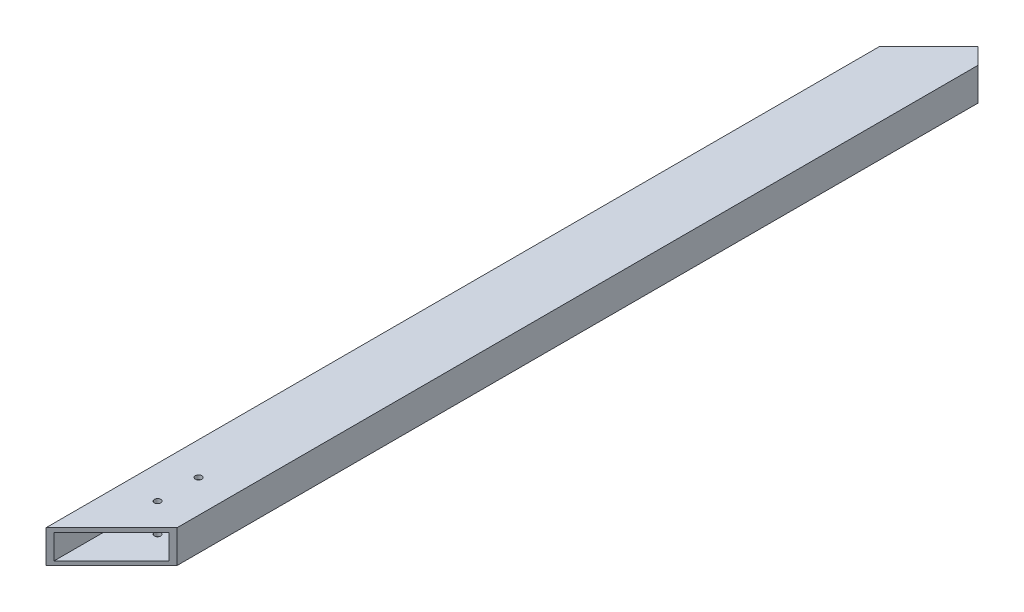
ISO-10303-21;
HEADER;
FILE_DESCRIPTION(('STEP AP214'),'2;1');
FILE_NAME('part.step','',(''),(''),'','','');
FILE_SCHEMA(('AUTOMOTIVE_DESIGN { 1 0 10303 214 1 1 1 1 }'));
ENDSEC;
DATA;
#1=APPLICATION_CONTEXT('core data for automotive mechanical design processes');
#2=APPLICATION_PROTOCOL_DEFINITION('international standard','automotive_design',2000,#1);
#3=PRODUCT_CONTEXT('',#1,'mechanical');
#4=PRODUCT('Part','Part','',(#3));
#5=PRODUCT_RELATED_PRODUCT_CATEGORY('part','',(#4));
#6=PRODUCT_DEFINITION_FORMATION('','',#4);
#7=PRODUCT_DEFINITION_CONTEXT('part definition',#1,'design');
#8=PRODUCT_DEFINITION('design','',#6,#7);
#9=PRODUCT_DEFINITION_SHAPE('','',#8);
#10=(LENGTH_UNIT() NAMED_UNIT(*) SI_UNIT(.MILLI.,.METRE.));
#11=(NAMED_UNIT(*) PLANE_ANGLE_UNIT() SI_UNIT($,.RADIAN.));
#12=(NAMED_UNIT(*) SI_UNIT($,.STERADIAN.) SOLID_ANGLE_UNIT());
#13=UNCERTAINTY_MEASURE_WITH_UNIT(LENGTH_MEASURE(1.E-05),#10,'distance_accuracy_value','');
#14=(GEOMETRIC_REPRESENTATION_CONTEXT(3) GLOBAL_UNCERTAINTY_ASSIGNED_CONTEXT((#13)) GLOBAL_UNIT_ASSIGNED_CONTEXT((#10,
#11,#12)) REPRESENTATION_CONTEXT('',''));
#15=CARTESIAN_POINT('',(0.,0.,0.));
#16=DIRECTION('',(0.,0.,1.));
#17=DIRECTION('',(1.,0.,0.));
#18=AXIS2_PLACEMENT_3D('',#15,#16,#17);
#19=CARTESIAN_POINT('',(-25.4,-12.7,697.2046));
#20=DIRECTION('',(1.,0.,0.));
#21=DIRECTION('',(0.,0.,-1.));
#22=AXIS2_PLACEMENT_3D('',#19,#20,#21);
#23=PLANE('',#22);
#24=DIRECTION('',(0.,0.,-1.));
#25=VECTOR('',#24,1.);
#26=CARTESIAN_POINT('',(-25.4,12.7,697.2046));
#27=LINE('',#26,#25);
#28=CARTESIAN_POINT('',(-25.4,12.7,697.2046));
#29=VERTEX_POINT('',#28);
#30=CARTESIAN_POINT('',(-25.4,12.7,50.8000000000008));
#31=VERTEX_POINT('',#30);
#32=EDGE_CURVE('E136',#29,#31,#27,.T.);
#33=ORIENTED_EDGE('',*,*,#32,.T.);
#34=DIRECTION('',(0.,1.,0.));
#35=VECTOR('',#34,1.);
#36=CARTESIAN_POINT('',(-25.4,-12.7,50.8000000000008));
#37=LINE('',#36,#35);
#38=CARTESIAN_POINT('',(-25.4,-12.7,50.8000000000008));
#39=VERTEX_POINT('',#38);
#40=EDGE_CURVE('E55',#39,#31,#37,.T.);
#41=ORIENTED_EDGE('',*,*,#40,.F.);
#42=DIRECTION('',(0.,0.,-1.));
#43=VECTOR('',#42,1.);
#44=CARTESIAN_POINT('',(-25.4,-12.7,697.2046));
#45=LINE('',#44,#43);
#46=CARTESIAN_POINT('',(-25.4,-12.7,697.2046));
#47=VERTEX_POINT('',#46);
#48=EDGE_CURVE('E131',#47,#39,#45,.T.);
#49=ORIENTED_EDGE('',*,*,#48,.F.);
#50=DIRECTION('',(0.,-1.,0.));
#51=VECTOR('',#50,1.);
#52=CARTESIAN_POINT('',(-25.4,-12.7,697.2046));
#53=LINE('',#52,#51);
#54=EDGE_CURVE('E170',#29,#47,#53,.T.);
#55=ORIENTED_EDGE('',*,*,#54,.F.);
#56=EDGE_LOOP('',(#33,#41,#49,#55));
#57=FACE_BOUND('',#56,.T.);
#58=ADVANCED_FACE('F33',(#57),#23,.F.);
#59=CARTESIAN_POINT('',(25.4,-12.7,697.2046));
#60=DIRECTION('',(0.,1.,0.));
#61=DIRECTION('',(-1.,0.,0.));
#62=AXIS2_PLACEMENT_3D('',#59,#60,#61);
#63=PLANE('',#62);
#64=CARTESIAN_POINT('',(-1.56892727976032E-11,-12.7,604.320502062895));
#65=DIRECTION('',(0.,-1.,0.));
#66=DIRECTION('',(0.,0.,-1.));
#67=AXIS2_PLACEMENT_3D('',#64,#65,#66);
#68=CIRCLE('',#67,2.45744999999999);
#69=CARTESIAN_POINT('',(-1.56892727976032E-11,-12.7,601.863052062895));
#70=VERTEX_POINT('',#69);
#71=EDGE_CURVE('E234',#70,#70,#68,.T.);
#72=ORIENTED_EDGE('',*,*,#71,.F.);
#73=EDGE_LOOP('',(#72));
#74=FACE_BOUND('',#73,.T.);
#75=CARTESIAN_POINT('',(-1.5481105980486E-11,-12.7,636.070502062895));
#76=DIRECTION('',(0.,-1.,0.));
#77=DIRECTION('',(0.,0.,-1.));
#78=AXIS2_PLACEMENT_3D('',#75,#76,#77);
#79=CIRCLE('',#78,2.45744999999999);
#80=CARTESIAN_POINT('',(-1.5481105980486E-11,-12.7,633.613052062895));
#81=VERTEX_POINT('',#80);
#82=EDGE_CURVE('E222',#81,#81,#79,.T.);
#83=ORIENTED_EDGE('',*,*,#82,.F.);
#84=EDGE_LOOP('',(#83));
#85=FACE_BOUND('',#84,.T.);
#86=DIRECTION('',(0.707106781186542,0.,-0.707106781186553));
#87=VECTOR('',#86,1.);
#88=CARTESIAN_POINT('',(25.4,-12.7,0.));
#89=LINE('',#88,#87);
#90=CARTESIAN_POINT('',(12.7508,-12.7,12.6492000000002));
#91=VERTEX_POINT('',#90);
#92=EDGE_CURVE('E126',#39,#91,#89,.T.);
#93=ORIENTED_EDGE('',*,*,#92,.T.);
#94=DIRECTION('',(0.707106781186559,0.,0.707106781186536));
#95=VECTOR('',#94,1.);
#96=CARTESIAN_POINT('',(25.4,-12.7,25.2984));
#97=LINE('',#96,#95);
#98=CARTESIAN_POINT('',(25.4,-12.7,25.2984));
#99=VERTEX_POINT('',#98);
#100=EDGE_CURVE('E47',#91,#99,#97,.T.);
#101=ORIENTED_EDGE('',*,*,#100,.T.);
#102=DIRECTION('',(0.,0.,-1.));
#103=VECTOR('',#102,1.);
#104=CARTESIAN_POINT('',(25.4,-12.7,697.2046));
#105=LINE('',#104,#103);
#106=CARTESIAN_POINT('',(25.4,-12.7,646.4046));
#107=VERTEX_POINT('',#106);
#108=EDGE_CURVE('E124',#107,#99,#105,.T.);
#109=ORIENTED_EDGE('',*,*,#108,.F.);
#110=DIRECTION('',(-0.707106781186546,0.,0.707106781186549));
#111=VECTOR('',#110,1.);
#112=CARTESIAN_POINT('',(-25.4,-12.7,697.2046));
#113=LINE('',#112,#111);
#114=EDGE_CURVE('E191',#107,#47,#113,.T.);
#115=ORIENTED_EDGE('',*,*,#114,.T.);
#116=ORIENTED_EDGE('',*,*,#48,.T.);
#117=EDGE_LOOP('',(#93,#101,#109,#115,#116));
#118=FACE_BOUND('',#117,.T.);
#119=ADVANCED_FACE('F122',(#74,#85,#118),#63,.F.);
#120=CARTESIAN_POINT('',(25.4,-12.7,697.2046));
#121=DIRECTION('',(-1.,0.,0.));
#122=DIRECTION('',(0.,0.,1.));
#123=AXIS2_PLACEMENT_3D('',#120,#121,#122);
#124=PLANE('',#123);
#125=ORIENTED_EDGE('',*,*,#108,.T.);
#126=DIRECTION('',(0.,1.,0.));
#127=VECTOR('',#126,1.);
#128=CARTESIAN_POINT('',(25.4,-12.7,25.2984));
#129=LINE('',#128,#127);
#130=CARTESIAN_POINT('',(25.4,12.7,25.2984));
#131=VERTEX_POINT('',#130);
#132=EDGE_CURVE('E108',#99,#131,#129,.T.);
#133=ORIENTED_EDGE('',*,*,#132,.T.);
#134=DIRECTION('',(0.,0.,-1.));
#135=VECTOR('',#134,1.);
#136=CARTESIAN_POINT('',(25.4,12.7,697.2046));
#137=LINE('',#136,#135);
#138=CARTESIAN_POINT('',(25.4,12.7,646.4046));
#139=VERTEX_POINT('',#138);
#140=EDGE_CURVE('E132',#139,#131,#137,.T.);
#141=ORIENTED_EDGE('',*,*,#140,.F.);
#142=DIRECTION('',(0.,1.,0.));
#143=VECTOR('',#142,1.);
#144=CARTESIAN_POINT('',(25.4,-12.7,646.4046));
#145=LINE('',#144,#143);
#146=EDGE_CURVE('E130',#107,#139,#145,.T.);
#147=ORIENTED_EDGE('',*,*,#146,.F.);
#148=EDGE_LOOP('',(#125,#133,#141,#147));
#149=FACE_BOUND('',#148,.T.);
#150=ADVANCED_FACE('F129',(#149),#124,.F.);
#151=CARTESIAN_POINT('',(25.4,12.7,697.2046));
#152=DIRECTION('',(0.,-1.,0.));
#153=DIRECTION('',(1.,0.,0.));
#154=AXIS2_PLACEMENT_3D('',#151,#152,#153);
#155=PLANE('',#154);
#156=CARTESIAN_POINT('',(-1.56892727976032E-11,12.7,604.320502062895));
#157=DIRECTION('',(0.,-1.,0.));
#158=DIRECTION('',(0.,0.,-1.));
#159=AXIS2_PLACEMENT_3D('',#156,#157,#158);
#160=CIRCLE('',#159,2.45744999999998);
#161=CARTESIAN_POINT('',(-1.56892727976032E-11,12.7,601.863052062895));
#162=VERTEX_POINT('',#161);
#163=EDGE_CURVE('E231',#162,#162,#160,.T.);
#164=ORIENTED_EDGE('',*,*,#163,.T.);
#165=EDGE_LOOP('',(#164));
#166=FACE_BOUND('',#165,.T.);
#167=CARTESIAN_POINT('',(-1.5481105980486E-11,12.7,636.070502062895));
#168=DIRECTION('',(0.,-1.,0.));
#169=DIRECTION('',(0.,0.,-1.));
#170=AXIS2_PLACEMENT_3D('',#167,#168,#169);
#171=CIRCLE('',#170,2.45744999999998);
#172=CARTESIAN_POINT('',(-1.5481105980486E-11,12.7,633.613052062895));
#173=VERTEX_POINT('',#172);
#174=EDGE_CURVE('E219',#173,#173,#171,.T.);
#175=ORIENTED_EDGE('',*,*,#174,.T.);
#176=EDGE_LOOP('',(#175));
#177=FACE_BOUND('',#176,.T.);
#178=ORIENTED_EDGE('',*,*,#140,.T.);
#179=DIRECTION('',(0.707106781186559,0.,0.707106781186536));
#180=VECTOR('',#179,1.);
#181=CARTESIAN_POINT('',(25.4,12.7,25.2984));
#182=LINE('',#181,#180);
#183=CARTESIAN_POINT('',(12.7508,12.7,12.6492000000004));
#184=VERTEX_POINT('',#183);
#185=EDGE_CURVE('E111',#184,#131,#182,.T.);
#186=ORIENTED_EDGE('',*,*,#185,.F.);
#187=DIRECTION('',(0.707106781186542,0.,-0.707106781186553));
#188=VECTOR('',#187,1.);
#189=CARTESIAN_POINT('',(25.4,12.7,0.));
#190=LINE('',#189,#188);
#191=EDGE_CURVE('E180',#31,#184,#190,.T.);
#192=ORIENTED_EDGE('',*,*,#191,.F.);
#193=ORIENTED_EDGE('',*,*,#32,.F.);
#194=DIRECTION('',(-0.707106781186546,0.,0.707106781186549));
#195=VECTOR('',#194,1.);
#196=CARTESIAN_POINT('',(-25.4,12.7,697.2046));
#197=LINE('',#196,#195);
#198=EDGE_CURVE('E179',#139,#29,#197,.T.);
#199=ORIENTED_EDGE('',*,*,#198,.F.);
#200=EDGE_LOOP('',(#178,#186,#192,#193,#199));
#201=FACE_BOUND('',#200,.T.);
#202=ADVANCED_FACE('F178',(#166,#177,#201),#155,.F.);
#203=CARTESIAN_POINT('',(22.225,-9.525,697.2046));
#204=DIRECTION('',(-1.,0.,0.));
#205=DIRECTION('',(0.,0.,1.));
#206=AXIS2_PLACEMENT_3D('',#203,#204,#205);
#207=PLANE('',#206);
#208=DIRECTION('',(0.,1.,0.));
#209=VECTOR('',#208,1.);
#210=CARTESIAN_POINT('',(22.225,-9.5249999999999,22.1234));
#211=LINE('',#210,#209);
#212=CARTESIAN_POINT('',(22.2249999999999,-9.525,22.1233999999999));
#213=VERTEX_POINT('',#212);
#214=CARTESIAN_POINT('',(22.225,9.525,22.1234));
#215=VERTEX_POINT('',#214);
#216=EDGE_CURVE('E184',#213,#215,#211,.T.);
#217=ORIENTED_EDGE('',*,*,#216,.F.);
#218=DIRECTION('',(0.,0.,-1.));
#219=VECTOR('',#218,1.);
#220=CARTESIAN_POINT('',(22.225,-9.525,697.2046));
#221=LINE('',#220,#219);
#222=CARTESIAN_POINT('',(22.225,-9.525,649.5796));
#223=VERTEX_POINT('',#222);
#224=EDGE_CURVE('E160',#223,#213,#221,.T.);
#225=ORIENTED_EDGE('',*,*,#224,.F.);
#226=DIRECTION('',(0.,-1.,0.));
#227=VECTOR('',#226,1.);
#228=CARTESIAN_POINT('',(22.225,-9.525,649.5796));
#229=LINE('',#228,#227);
#230=CARTESIAN_POINT('',(22.225,9.525,649.5796));
#231=VERTEX_POINT('',#230);
#232=EDGE_CURVE('E164',#231,#223,#229,.T.);
#233=ORIENTED_EDGE('',*,*,#232,.F.);
#234=DIRECTION('',(0.,0.,-1.));
#235=VECTOR('',#234,1.);
#236=CARTESIAN_POINT('',(22.225,9.525,697.2046));
#237=LINE('',#236,#235);
#238=EDGE_CURVE('E162',#231,#215,#237,.T.);
#239=ORIENTED_EDGE('',*,*,#238,.T.);
#240=EDGE_LOOP('',(#217,#225,#233,#239));
#241=FACE_BOUND('',#240,.T.);
#242=ADVANCED_FACE('F206',(#241),#207,.T.);
#243=CARTESIAN_POINT('',(22.225,9.525,697.2046));
#244=DIRECTION('',(0.,-1.,0.));
#245=DIRECTION('',(1.,0.,0.));
#246=AXIS2_PLACEMENT_3D('',#243,#244,#245);
#247=PLANE('',#246);
#248=CARTESIAN_POINT('',(-1.56892727976032E-11,9.525,604.320502062895));
#249=DIRECTION('',(0.,-1.,0.));
#250=DIRECTION('',(1.,0.,0.));
#251=AXIS2_PLACEMENT_3D('',#248,#249,#250);
#252=CIRCLE('',#251,2.45744999999998);
#253=CARTESIAN_POINT('',(2.4574499999843,9.525,604.320502062895));
#254=VERTEX_POINT('',#253);
#255=EDGE_CURVE('E225',#254,#254,#252,.T.);
#256=ORIENTED_EDGE('',*,*,#255,.F.);
#257=EDGE_LOOP('',(#256));
#258=FACE_BOUND('',#257,.T.);
#259=CARTESIAN_POINT('',(-1.5481105980486E-11,9.525,636.070502062895));
#260=DIRECTION('',(0.,-1.,0.));
#261=DIRECTION('',(1.,0.,0.));
#262=AXIS2_PLACEMENT_3D('',#259,#260,#261);
#263=CIRCLE('',#262,2.45744999999998);
#264=CARTESIAN_POINT('',(2.4574499999845,9.525,636.070502062895));
#265=VERTEX_POINT('',#264);
#266=EDGE_CURVE('E216',#265,#265,#263,.T.);
#267=ORIENTED_EDGE('',*,*,#266,.F.);
#268=EDGE_LOOP('',(#267));
#269=FACE_BOUND('',#268,.T.);
#270=DIRECTION('',(-0.707106781186559,0.,-0.707106781186536));
#271=VECTOR('',#270,1.);
#272=CARTESIAN_POINT('',(359.7656,9.52500000000002,359.663999999989));
#273=LINE('',#272,#271);
#274=CARTESIAN_POINT('',(12.7508,9.525,12.6492000000004));
#275=VERTEX_POINT('',#274);
#276=EDGE_CURVE('E181',#215,#275,#273,.T.);
#277=ORIENTED_EDGE('',*,*,#276,.F.);
#278=ORIENTED_EDGE('',*,*,#238,.F.);
#279=DIRECTION('',(0.707106781186546,0.,-0.707106781186549));
#280=VECTOR('',#279,1.);
#281=CARTESIAN_POINT('',(-1.58750000000009,9.525,673.3921));
#282=LINE('',#281,#280);
#283=CARTESIAN_POINT('',(-22.225,9.525,694.0296));
#284=VERTEX_POINT('',#283);
#285=EDGE_CURVE('E196',#284,#231,#282,.T.);
#286=ORIENTED_EDGE('',*,*,#285,.F.);
#287=DIRECTION('',(0.,0.,-1.));
#288=VECTOR('',#287,1.);
#289=CARTESIAN_POINT('',(-22.225,9.525,697.2046));
#290=LINE('',#289,#288);
#291=CARTESIAN_POINT('',(-22.225,9.525,47.6250000000008));
#292=VERTEX_POINT('',#291);
#293=EDGE_CURVE('E159',#284,#292,#290,.T.);
#294=ORIENTED_EDGE('',*,*,#293,.T.);
#295=DIRECTION('',(-0.707106781186542,0.,0.707106781186553));
#296=VECTOR('',#295,1.);
#297=CARTESIAN_POINT('',(-324.7898,9.52499999999999,350.189800000006));
#298=LINE('',#297,#296);
#299=EDGE_CURVE('E189',#275,#292,#298,.T.);
#300=ORIENTED_EDGE('',*,*,#299,.F.);
#301=EDGE_LOOP('',(#277,#278,#286,#294,#300));
#302=FACE_BOUND('',#301,.T.);
#303=ADVANCED_FACE('F293',(#258,#269,#302),#247,.T.);
#304=CARTESIAN_POINT('',(-22.225,-9.525,697.2046));
#305=DIRECTION('',(1.,0.,0.));
#306=DIRECTION('',(0.,1.,0.));
#307=AXIS2_PLACEMENT_3D('',#304,#305,#306);
#308=PLANE('',#307);
#309=DIRECTION('',(0.,-1.,0.));
#310=VECTOR('',#309,1.);
#311=CARTESIAN_POINT('',(-22.225,-9.5250000000002,47.6250000000008));
#312=LINE('',#311,#310);
#313=CARTESIAN_POINT('',(-22.225,-9.525,47.6250000000007));
#314=VERTEX_POINT('',#313);
#315=EDGE_CURVE('E144',#292,#314,#312,.T.);
#316=ORIENTED_EDGE('',*,*,#315,.F.);
#317=ORIENTED_EDGE('',*,*,#293,.F.);
#318=DIRECTION('',(0.,1.,0.));
#319=VECTOR('',#318,1.);
#320=CARTESIAN_POINT('',(-22.225,-9.525,694.0296));
#321=LINE('',#320,#319);
#322=CARTESIAN_POINT('',(-22.225,-9.525,694.0296));
#323=VERTEX_POINT('',#322);
#324=EDGE_CURVE('E158',#323,#284,#321,.T.);
#325=ORIENTED_EDGE('',*,*,#324,.F.);
#326=DIRECTION('',(0.,0.,-1.));
#327=VECTOR('',#326,1.);
#328=CARTESIAN_POINT('',(-22.225,-9.525,697.2046));
#329=LINE('',#328,#327);
#330=EDGE_CURVE('E151',#323,#314,#329,.T.);
#331=ORIENTED_EDGE('',*,*,#330,.T.);
#332=EDGE_LOOP('',(#316,#317,#325,#331));
#333=FACE_BOUND('',#332,.T.);
#334=ADVANCED_FACE('F155',(#333),#308,.T.);
#335=CARTESIAN_POINT('',(22.225,-9.525,697.2046));
#336=DIRECTION('',(0.,1.,0.));
#337=DIRECTION('',(0.,0.,1.));
#338=AXIS2_PLACEMENT_3D('',#335,#336,#337);
#339=PLANE('',#338);
#340=CARTESIAN_POINT('',(-1.56892727976032E-11,-9.525,604.320502062895));
#341=DIRECTION('',(0.,1.,0.));
#342=DIRECTION('',(0.,0.,1.));
#343=AXIS2_PLACEMENT_3D('',#340,#341,#342);
#344=CIRCLE('',#343,2.45744999999998);
#345=CARTESIAN_POINT('',(-1.56892727976032E-11,-9.525,606.777952062895));
#346=VERTEX_POINT('',#345);
#347=EDGE_CURVE('E228',#346,#346,#344,.T.);
#348=ORIENTED_EDGE('',*,*,#347,.F.);
#349=EDGE_LOOP('',(#348));
#350=FACE_BOUND('',#349,.T.);
#351=CARTESIAN_POINT('',(-1.5481105980486E-11,-9.525,636.070502062895));
#352=DIRECTION('',(0.,1.,0.));
#353=DIRECTION('',(0.,0.,1.));
#354=AXIS2_PLACEMENT_3D('',#351,#352,#353);
#355=CIRCLE('',#354,2.45744999999998);
#356=CARTESIAN_POINT('',(-1.5481105980486E-11,-9.525,638.527952062895));
#357=VERTEX_POINT('',#356);
#358=EDGE_CURVE('E212',#357,#357,#355,.T.);
#359=ORIENTED_EDGE('',*,*,#358,.F.);
#360=EDGE_LOOP('',(#359));
#361=FACE_BOUND('',#360,.T.);
#362=DIRECTION('',(0.707106781186559,0.,0.707106781186536));
#363=VECTOR('',#362,1.);
#364=CARTESIAN_POINT('',(359.7656,-9.525,359.663999999989));
#365=LINE('',#364,#363);
#366=CARTESIAN_POINT('',(12.7508,-9.525,12.6492000000004));
#367=VERTEX_POINT('',#366);
#368=EDGE_CURVE('E116',#367,#213,#365,.T.);
#369=ORIENTED_EDGE('',*,*,#368,.F.);
#370=DIRECTION('',(0.707106781186542,0.,-0.707106781186553));
#371=VECTOR('',#370,1.);
#372=CARTESIAN_POINT('',(-324.7898,-9.525,350.189800000006));
#373=LINE('',#372,#371);
#374=EDGE_CURVE('E40',#314,#367,#373,.T.);
#375=ORIENTED_EDGE('',*,*,#374,.F.);
#376=ORIENTED_EDGE('',*,*,#330,.F.);
#377=DIRECTION('',(-0.707106781186546,0.,0.707106781186549));
#378=VECTOR('',#377,1.);
#379=CARTESIAN_POINT('',(-1.58750000000009,-9.525,673.3921));
#380=LINE('',#379,#378);
#381=EDGE_CURVE('E134',#223,#323,#380,.T.);
#382=ORIENTED_EDGE('',*,*,#381,.F.);
#383=ORIENTED_EDGE('',*,*,#224,.T.);
#384=EDGE_LOOP('',(#369,#375,#376,#382,#383));
#385=FACE_BOUND('',#384,.T.);
#386=ADVANCED_FACE('F149',(#350,#361,#385),#339,.T.);
#387=CARTESIAN_POINT('',(-25.4,-12.7,697.2046));
#388=DIRECTION('',(-0.707106781186549,0.,-0.707106781186546));
#389=DIRECTION('',(-0.707106781186546,0.,0.707106781186549));
#390=AXIS2_PLACEMENT_3D('',#387,#388,#389);
#391=PLANE('',#390);
#392=ORIENTED_EDGE('',*,*,#232,.T.);
#393=ORIENTED_EDGE('',*,*,#381,.T.);
#394=ORIENTED_EDGE('',*,*,#324,.T.);
#395=ORIENTED_EDGE('',*,*,#285,.T.);
#396=EDGE_LOOP('',(#392,#393,#394,#395));
#397=FACE_BOUND('',#396,.T.);
#398=ORIENTED_EDGE('',*,*,#198,.T.);
#399=ORIENTED_EDGE('',*,*,#54,.T.);
#400=ORIENTED_EDGE('',*,*,#114,.F.);
#401=ORIENTED_EDGE('',*,*,#146,.T.);
#402=EDGE_LOOP('',(#398,#399,#400,#401));
#403=FACE_BOUND('',#402,.T.);
#404=ADVANCED_FACE('F199',(#397,#403),#391,.F.);
#405=CARTESIAN_POINT('',(25.4,-12.7,0.));
#406=DIRECTION('',(0.707106781186553,0.,0.707106781186542));
#407=DIRECTION('',(0.707106781186542,0.,-0.707106781186553));
#408=AXIS2_PLACEMENT_3D('',#405,#406,#407);
#409=PLANE('',#408);
#410=ORIENTED_EDGE('',*,*,#191,.T.);
#411=DIRECTION('',(0.,-1.,0.));
#412=VECTOR('',#411,1.);
#413=CARTESIAN_POINT('',(12.7507999999999,-12.7,12.6492000000003));
#414=LINE('',#413,#412);
#415=EDGE_CURVE('E11',#184,#275,#414,.T.);
#416=ORIENTED_EDGE('',*,*,#415,.T.);
#417=ORIENTED_EDGE('',*,*,#299,.T.);
#418=ORIENTED_EDGE('',*,*,#315,.T.);
#419=ORIENTED_EDGE('',*,*,#374,.T.);
#420=DIRECTION('',(0.,1.,0.));
#421=VECTOR('',#420,1.);
#422=CARTESIAN_POINT('',(12.7508,-12.7,12.6492000000004));
#423=LINE('',#422,#421);
#424=EDGE_CURVE('E117',#91,#367,#423,.T.);
#425=ORIENTED_EDGE('',*,*,#424,.F.);
#426=ORIENTED_EDGE('',*,*,#92,.F.);
#427=ORIENTED_EDGE('',*,*,#40,.T.);
#428=EDGE_LOOP('',(#410,#416,#417,#418,#419,#425,#426,#427));
#429=FACE_BOUND('',#428,.T.);
#430=ADVANCED_FACE('F142',(#429),#409,.F.);
#431=CARTESIAN_POINT('',(25.4,-12.7,25.2984));
#432=DIRECTION('',(-0.707106781186536,0.,0.707106781186559));
#433=DIRECTION('',(0.707106781186559,0.,0.707106781186536));
#434=AXIS2_PLACEMENT_3D('',#431,#432,#433);
#435=PLANE('',#434);
#436=ORIENTED_EDGE('',*,*,#276,.T.);
#437=ORIENTED_EDGE('',*,*,#415,.F.);
#438=ORIENTED_EDGE('',*,*,#185,.T.);
#439=ORIENTED_EDGE('',*,*,#132,.F.);
#440=ORIENTED_EDGE('',*,*,#100,.F.);
#441=ORIENTED_EDGE('',*,*,#424,.T.);
#442=ORIENTED_EDGE('',*,*,#368,.T.);
#443=ORIENTED_EDGE('',*,*,#216,.T.);
#444=EDGE_LOOP('',(#436,#437,#438,#439,#440,#441,#442,#443));
#445=FACE_BOUND('',#444,.T.);
#446=ADVANCED_FACE('F109',(#445),#435,.F.);
#447=CARTESIAN_POINT('',(-1.5481105980486E-11,-12.7,636.070502062895));
#448=DIRECTION('',(0.,-1.,0.));
#449=DIRECTION('',(0.,0.,-1.));
#450=AXIS2_PLACEMENT_3D('',#447,#448,#449);
#451=CYLINDRICAL_SURFACE('',#450,2.45744999999998);
#452=ORIENTED_EDGE('',*,*,#266,.T.);
#453=EDGE_LOOP('',(#452));
#454=FACE_BOUND('',#453,.T.);
#455=ORIENTED_EDGE('',*,*,#174,.F.);
#456=EDGE_LOOP('',(#455));
#457=FACE_BOUND('',#456,.T.);
#458=ADVANCED_FACE('F247',(#454,#457),#451,.F.);
#459=ORIENTED_EDGE('',*,*,#358,.T.);
#460=EDGE_LOOP('',(#459));
#461=FACE_BOUND('',#460,.T.);
#462=ORIENTED_EDGE('',*,*,#82,.T.);
#463=EDGE_LOOP('',(#462));
#464=FACE_BOUND('',#463,.T.);
#465=ADVANCED_FACE('F244',(#461,#464),#451,.F.);
#466=CARTESIAN_POINT('',(-1.56892727976032E-11,-12.7,604.320502062895));
#467=DIRECTION('',(0.,-1.,0.));
#468=DIRECTION('',(0.,0.,-1.));
#469=AXIS2_PLACEMENT_3D('',#466,#467,#468);
#470=CYLINDRICAL_SURFACE('',#469,2.45744999999998);
#471=ORIENTED_EDGE('',*,*,#255,.T.);
#472=EDGE_LOOP('',(#471));
#473=FACE_BOUND('',#472,.T.);
#474=ORIENTED_EDGE('',*,*,#163,.F.);
#475=EDGE_LOOP('',(#474));
#476=FACE_BOUND('',#475,.T.);
#477=ADVANCED_FACE('F246',(#473,#476),#470,.F.);
#478=ORIENTED_EDGE('',*,*,#347,.T.);
#479=EDGE_LOOP('',(#478));
#480=FACE_BOUND('',#479,.T.);
#481=ORIENTED_EDGE('',*,*,#71,.T.);
#482=EDGE_LOOP('',(#481));
#483=FACE_BOUND('',#482,.T.);
#484=ADVANCED_FACE('F238',(#480,#483),#470,.F.);
#485=CLOSED_SHELL('',(#58,#119,#150,#202,#242,#303,#334,#386,#404,#430,#446,#458,#465,#477,#484));
#486=MANIFOLD_SOLID_BREP('B2',#485);
#487=ADVANCED_BREP_SHAPE_REPRESENTATION('',(#18,#486),#14);
#488=SHAPE_DEFINITION_REPRESENTATION(#9,#487);
ENDSEC;
END-ISO-10303-21;
